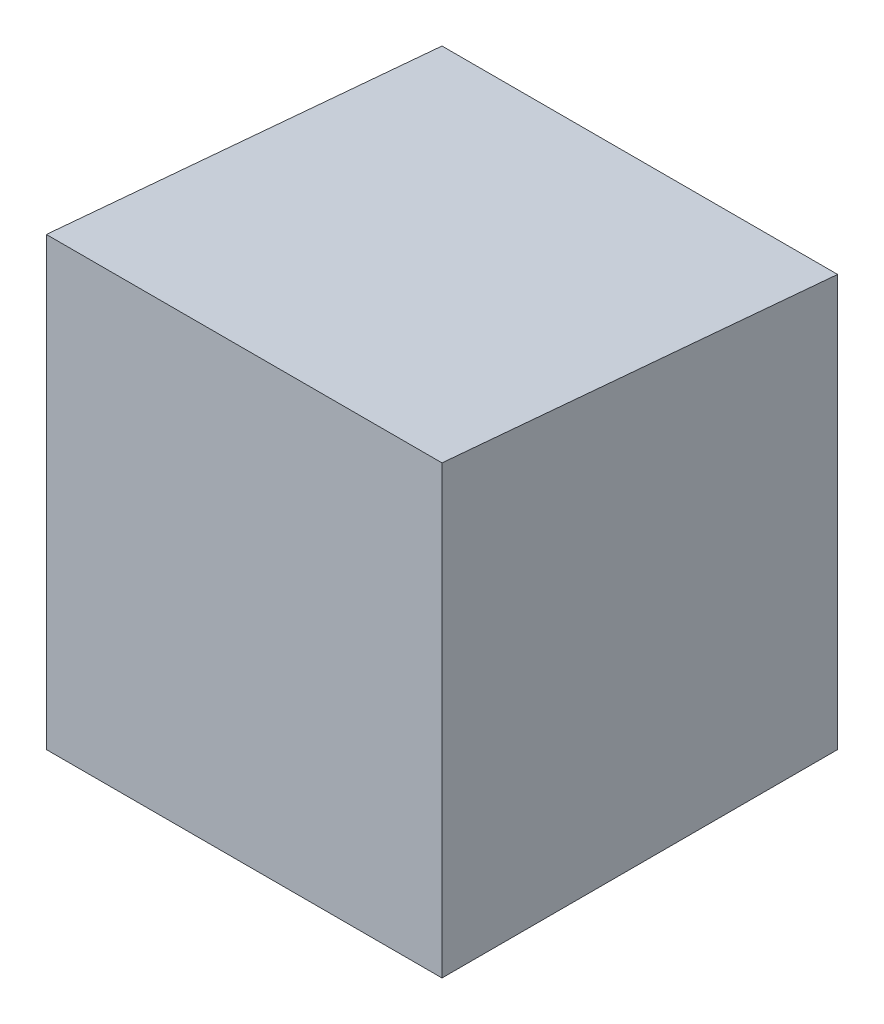
ISO-10303-21;
HEADER;
FILE_DESCRIPTION(('STEP AP214'),'2;1');
FILE_NAME('part.step','',(''),(''),'','','');
FILE_SCHEMA(('AUTOMOTIVE_DESIGN { 1 0 10303 214 1 1 1 1 }'));
ENDSEC;
DATA;
#1=APPLICATION_CONTEXT('core data for automotive mechanical design processes');
#2=APPLICATION_PROTOCOL_DEFINITION('international standard','automotive_design',2000,#1);
#3=PRODUCT_CONTEXT('',#1,'mechanical');
#4=PRODUCT('Part','Part','',(#3));
#5=PRODUCT_RELATED_PRODUCT_CATEGORY('part','',(#4));
#6=PRODUCT_DEFINITION_FORMATION('','',#4);
#7=PRODUCT_DEFINITION_CONTEXT('part definition',#1,'design');
#8=PRODUCT_DEFINITION('design','',#6,#7);
#9=PRODUCT_DEFINITION_SHAPE('','',#8);
#10=(LENGTH_UNIT() NAMED_UNIT(*) SI_UNIT(.MILLI.,.METRE.));
#11=(NAMED_UNIT(*) PLANE_ANGLE_UNIT() SI_UNIT($,.RADIAN.));
#12=(NAMED_UNIT(*) SI_UNIT($,.STERADIAN.) SOLID_ANGLE_UNIT());
#13=UNCERTAINTY_MEASURE_WITH_UNIT(LENGTH_MEASURE(1.E-05),#10,'distance_accuracy_value','');
#14=(GEOMETRIC_REPRESENTATION_CONTEXT(3) GLOBAL_UNCERTAINTY_ASSIGNED_CONTEXT((#13)) GLOBAL_UNIT_ASSIGNED_CONTEXT((#10,
#11,#12)) REPRESENTATION_CONTEXT('',''));
#15=CARTESIAN_POINT('',(0.,0.,0.));
#16=DIRECTION('',(0.,0.,1.));
#17=DIRECTION('',(1.,0.,0.));
#18=AXIS2_PLACEMENT_3D('',#15,#16,#17);
#19=CARTESIAN_POINT('',(0.,0.,0.));
#20=DIRECTION('',(0.,-1.,0.));
#21=DIRECTION('',(0.,0.,-1.));
#22=AXIS2_PLACEMENT_3D('',#19,#20,#21);
#23=PLANE('',#22);
#24=DIRECTION('',(0.,0.,-1.));
#25=VECTOR('',#24,1.);
#26=CARTESIAN_POINT('',(50.,0.,50.));
#27=LINE('',#26,#25);
#28=CARTESIAN_POINT('',(50.,0.,50.));
#29=VERTEX_POINT('',#28);
#30=CARTESIAN_POINT('',(50.,0.,-50.));
#31=VERTEX_POINT('',#30);
#32=EDGE_CURVE('E87',#29,#31,#27,.T.);
#33=ORIENTED_EDGE('',*,*,#32,.F.);
#34=DIRECTION('',(1.,0.,0.));
#35=VECTOR('',#34,1.);
#36=CARTESIAN_POINT('',(-50.,0.,50.));
#37=LINE('',#36,#35);
#38=CARTESIAN_POINT('',(-50.,0.,50.));
#39=VERTEX_POINT('',#38);
#40=EDGE_CURVE('E98',#39,#29,#37,.T.);
#41=ORIENTED_EDGE('',*,*,#40,.F.);
#42=DIRECTION('',(0.,0.,1.));
#43=VECTOR('',#42,1.);
#44=CARTESIAN_POINT('',(-50.,0.,50.));
#45=LINE('',#44,#43);
#46=CARTESIAN_POINT('',(-50.,0.,-50.));
#47=VERTEX_POINT('',#46);
#48=EDGE_CURVE('E89',#47,#39,#45,.T.);
#49=ORIENTED_EDGE('',*,*,#48,.F.);
#50=DIRECTION('',(-1.,0.,0.));
#51=VECTOR('',#50,1.);
#52=CARTESIAN_POINT('',(-50.,0.,-50.));
#53=LINE('',#52,#51);
#54=EDGE_CURVE('E79',#31,#47,#53,.T.);
#55=ORIENTED_EDGE('',*,*,#54,.F.);
#56=EDGE_LOOP('',(#33,#41,#49,#55));
#57=FACE_BOUND('',#56,.T.);
#58=ADVANCED_FACE('F37',(#57),#23,.T.);
#59=CARTESIAN_POINT('',(-50.,250.075721429158,50.));
#60=DIRECTION('',(0.,0.,-1.));
#61=DIRECTION('',(-1.,0.,0.));
#62=AXIS2_PLACEMENT_3D('',#59,#60,#61);
#63=PLANE('',#62);
#64=DIRECTION('',(0.,-1.,0.));
#65=VECTOR('',#64,1.);
#66=CARTESIAN_POINT('',(50.,250.075721429158,50.));
#67=LINE('',#66,#65);
#68=CARTESIAN_POINT('',(50.,112.758695065151,50.));
#69=VERTEX_POINT('',#68);
#70=EDGE_CURVE('E92',#69,#29,#67,.T.);
#71=ORIENTED_EDGE('',*,*,#70,.F.);
#72=DIRECTION('',(-1.,0.,0.));
#73=VECTOR('',#72,1.);
#74=CARTESIAN_POINT('',(-50.,112.758695065151,50.));
#75=LINE('',#74,#73);
#76=CARTESIAN_POINT('',(-50.,112.758695065151,50.));
#77=VERTEX_POINT('',#76);
#78=EDGE_CURVE('E41',#69,#77,#75,.T.);
#79=ORIENTED_EDGE('',*,*,#78,.T.);
#80=DIRECTION('',(0.,-1.,0.));
#81=VECTOR('',#80,1.);
#82=CARTESIAN_POINT('',(-50.,250.075721429158,50.));
#83=LINE('',#82,#81);
#84=EDGE_CURVE('E101',#77,#39,#83,.T.);
#85=ORIENTED_EDGE('',*,*,#84,.T.);
#86=ORIENTED_EDGE('',*,*,#40,.T.);
#87=EDGE_LOOP('',(#71,#79,#85,#86));
#88=FACE_BOUND('',#87,.T.);
#89=ADVANCED_FACE('F110',(#88),#63,.F.);
#90=CARTESIAN_POINT('',(-50.,250.075721429158,50.));
#91=DIRECTION('',(1.,0.,0.));
#92=DIRECTION('',(0.,0.,-1.));
#93=AXIS2_PLACEMENT_3D('',#90,#91,#92);
#94=PLANE('',#93);
#95=ORIENTED_EDGE('',*,*,#84,.F.);
#96=DIRECTION('',(0.,-0.0871557427476516,-0.996194698091746));
#97=VECTOR('',#96,1.);
#98=CARTESIAN_POINT('',(-50.,113.801772155226,61.9224256953749));
#99=LINE('',#98,#97);
#100=CARTESIAN_POINT('',(-50.,104.009828712559,-50.));
#101=VERTEX_POINT('',#100);
#102=EDGE_CURVE('E107',#77,#101,#99,.T.);
#103=ORIENTED_EDGE('',*,*,#102,.T.);
#104=DIRECTION('',(0.,-1.,0.));
#105=VECTOR('',#104,1.);
#106=CARTESIAN_POINT('',(-50.,250.075721429158,-50.));
#107=LINE('',#106,#105);
#108=EDGE_CURVE('E83',#101,#47,#107,.T.);
#109=ORIENTED_EDGE('',*,*,#108,.T.);
#110=ORIENTED_EDGE('',*,*,#48,.T.);
#111=EDGE_LOOP('',(#95,#103,#109,#110));
#112=FACE_BOUND('',#111,.T.);
#113=ADVANCED_FACE('F106',(#112),#94,.F.);
#114=CARTESIAN_POINT('',(-50.,250.075721429158,-50.));
#115=DIRECTION('',(0.,0.,1.));
#116=DIRECTION('',(1.,0.,0.));
#117=AXIS2_PLACEMENT_3D('',#114,#115,#116);
#118=PLANE('',#117);
#119=ORIENTED_EDGE('',*,*,#108,.F.);
#120=DIRECTION('',(1.,0.,0.));
#121=VECTOR('',#120,1.);
#122=CARTESIAN_POINT('',(-50.,104.009828712559,-50.));
#123=LINE('',#122,#121);
#124=CARTESIAN_POINT('',(50.,104.009828712559,-50.));
#125=VERTEX_POINT('',#124);
#126=EDGE_CURVE('E46',#101,#125,#123,.T.);
#127=ORIENTED_EDGE('',*,*,#126,.T.);
#128=DIRECTION('',(0.,-1.,0.));
#129=VECTOR('',#128,1.);
#130=CARTESIAN_POINT('',(50.,250.075721429158,-50.));
#131=LINE('',#130,#129);
#132=EDGE_CURVE('E76',#125,#31,#131,.T.);
#133=ORIENTED_EDGE('',*,*,#132,.T.);
#134=ORIENTED_EDGE('',*,*,#54,.T.);
#135=EDGE_LOOP('',(#119,#127,#133,#134));
#136=FACE_BOUND('',#135,.T.);
#137=ADVANCED_FACE('F78',(#136),#118,.F.);
#138=CARTESIAN_POINT('',(50.,250.075721429158,50.));
#139=DIRECTION('',(-1.,0.,0.));
#140=DIRECTION('',(0.,0.,1.));
#141=AXIS2_PLACEMENT_3D('',#138,#139,#140);
#142=PLANE('',#141);
#143=ORIENTED_EDGE('',*,*,#132,.F.);
#144=DIRECTION('',(0.,0.0871557427476516,0.996194698091746));
#145=VECTOR('',#144,1.);
#146=CARTESIAN_POINT('',(50.,113.801772155226,61.9224256953749));
#147=LINE('',#146,#145);
#148=EDGE_CURVE('E11',#125,#69,#147,.T.);
#149=ORIENTED_EDGE('',*,*,#148,.T.);
#150=ORIENTED_EDGE('',*,*,#70,.T.);
#151=ORIENTED_EDGE('',*,*,#32,.T.);
#152=EDGE_LOOP('',(#143,#149,#150,#151));
#153=FACE_BOUND('',#152,.T.);
#154=ADVANCED_FACE('F39',(#153),#142,.F.);
#155=CARTESIAN_POINT('',(87.8233716353887,86.495769018343,-250.186618338589));
#156=DIRECTION('',(0.,-0.996194698091746,0.0871557427476516));
#157=DIRECTION('',(0.,-0.0871557427476516,-0.996194698091746));
#158=AXIS2_PLACEMENT_3D('',#155,#156,#157);
#159=PLANE('',#158);
#160=ORIENTED_EDGE('',*,*,#126,.F.);
#161=ORIENTED_EDGE('',*,*,#102,.F.);
#162=ORIENTED_EDGE('',*,*,#78,.F.);
#163=ORIENTED_EDGE('',*,*,#148,.F.);
#164=EDGE_LOOP('',(#160,#161,#162,#163));
#165=FACE_BOUND('',#164,.T.);
#166=ADVANCED_FACE('F124',(#165),#159,.F.);
#167=CLOSED_SHELL('',(#58,#89,#113,#137,#154,#166));
#168=MANIFOLD_SOLID_BREP('B2',#167);
#169=ADVANCED_BREP_SHAPE_REPRESENTATION('',(#18,#168),#14);
#170=SHAPE_DEFINITION_REPRESENTATION(#9,#169);
ENDSEC;
END-ISO-10303-21;
